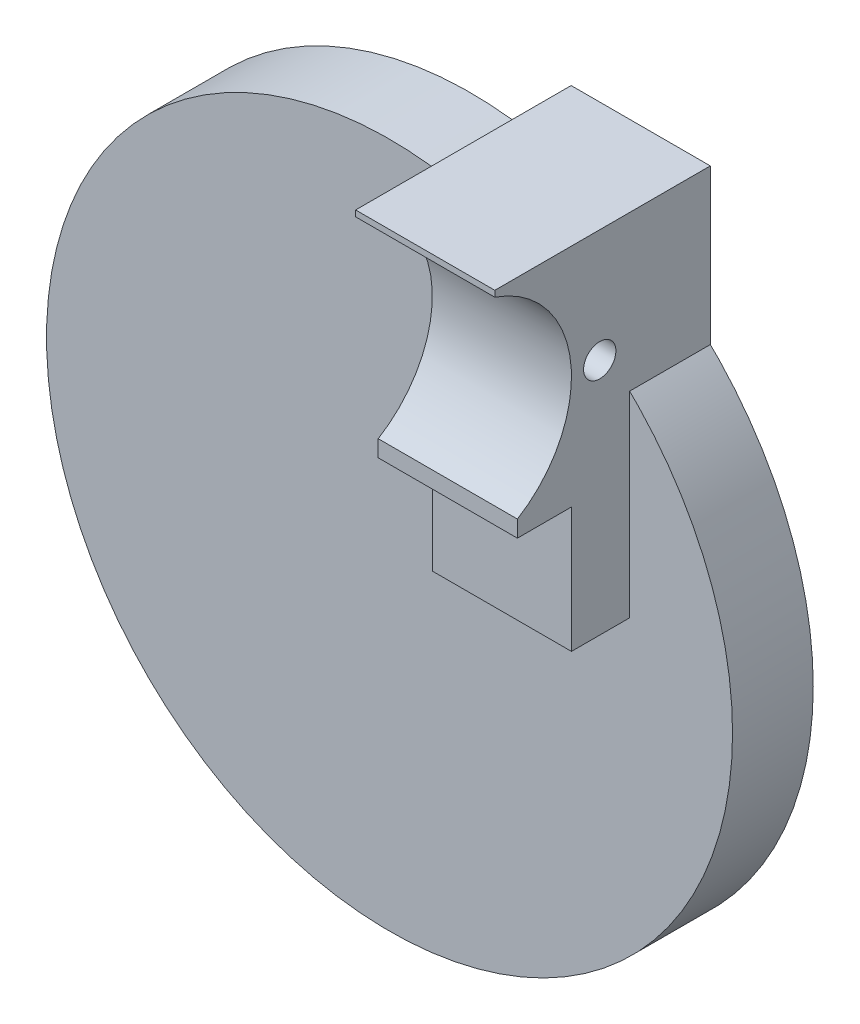
ISO-10303-21;
HEADER;
FILE_DESCRIPTION(('STEP AP214'),'2;1');
FILE_NAME('part.step','',(''),(''),'','','');
FILE_SCHEMA(('AUTOMOTIVE_DESIGN { 1 0 10303 214 1 1 1 1 }'));
ENDSEC;
DATA;
#1=APPLICATION_CONTEXT('core data for automotive mechanical design processes');
#2=APPLICATION_PROTOCOL_DEFINITION('international standard','automotive_design',2000,#1);
#3=PRODUCT_CONTEXT('',#1,'mechanical');
#4=PRODUCT('Part','Part','',(#3));
#5=PRODUCT_RELATED_PRODUCT_CATEGORY('part','',(#4));
#6=PRODUCT_DEFINITION_FORMATION('','',#4);
#7=PRODUCT_DEFINITION_CONTEXT('part definition',#1,'design');
#8=PRODUCT_DEFINITION('design','',#6,#7);
#9=PRODUCT_DEFINITION_SHAPE('','',#8);
#10=(LENGTH_UNIT() NAMED_UNIT(*) SI_UNIT(.MILLI.,.METRE.));
#11=(NAMED_UNIT(*) PLANE_ANGLE_UNIT() SI_UNIT($,.RADIAN.));
#12=(NAMED_UNIT(*) SI_UNIT($,.STERADIAN.) SOLID_ANGLE_UNIT());
#13=UNCERTAINTY_MEASURE_WITH_UNIT(LENGTH_MEASURE(1.E-05),#10,'distance_accuracy_value','');
#14=(GEOMETRIC_REPRESENTATION_CONTEXT(3) GLOBAL_UNCERTAINTY_ASSIGNED_CONTEXT((#13)) GLOBAL_UNIT_ASSIGNED_CONTEXT((#10,
#11,#12)) REPRESENTATION_CONTEXT('',''));
#15=CARTESIAN_POINT('',(0.,0.,0.));
#16=DIRECTION('',(0.,0.,1.));
#17=DIRECTION('',(1.,0.,0.));
#18=AXIS2_PLACEMENT_3D('',#15,#16,#17);
#19=CARTESIAN_POINT('',(12.5,49.5,17.2));
#20=DIRECTION('',(1.,0.,0.));
#21=DIRECTION('',(0.,1.,0.));
#22=AXIS2_PLACEMENT_3D('',#19,#20,#21);
#23=PLANE('',#22);
#24=CARTESIAN_POINT('',(12.5,35.5,13.7));
#25=DIRECTION('',(1.,0.,0.));
#26=DIRECTION('',(0.,1.,0.));
#27=AXIS2_PLACEMENT_3D('',#24,#25,#26);
#28=CIRCLE('',#27,2.);
#29=CARTESIAN_POINT('',(12.5,37.5,13.7));
#30=VERTEX_POINT('',#29);
#31=EDGE_CURVE('E242',#30,#30,#28,.F.);
#32=ORIENTED_EDGE('',*,*,#31,.F.);
#33=EDGE_LOOP('',(#32));
#34=FACE_BOUND('',#33,.T.);
#35=CARTESIAN_POINT('',(12.5,18.7225374558526,7.5));
#36=DIRECTION('',(1.,0.,0.));
#37=DIRECTION('',(0.,1.,0.));
#38=AXIS2_PLACEMENT_3D('',#35,#36,#37);
#39=CIRCLE('',#38,1.5);
#40=CARTESIAN_POINT('',(12.5,20.2225374558526,7.5));
#41=VERTEX_POINT('',#40);
#42=EDGE_CURVE('E261',#41,#41,#39,.T.);
#43=ORIENTED_EDGE('',*,*,#42,.T.);
#44=EDGE_LOOP('',(#43));
#45=FACE_BOUND('',#44,.T.);
#46=DIRECTION('',(0.,0.,1.));
#47=VECTOR('',#46,1.);
#48=CARTESIAN_POINT('',(12.5,21.5,17.2));
#49=LINE('',#48,#47);
#50=CARTESIAN_POINT('',(12.5,21.5,17.2));
#51=VERTEX_POINT('',#50);
#52=CARTESIAN_POINT('',(12.5,21.5,23.9));
#53=VERTEX_POINT('',#52);
#54=EDGE_CURVE('E250',#51,#53,#49,.T.);
#55=ORIENTED_EDGE('',*,*,#54,.T.);
#56=DIRECTION('',(0.,-1.,0.));
#57=VECTOR('',#56,1.);
#58=CARTESIAN_POINT('',(12.5,49.501,23.9));
#59=LINE('',#58,#57);
#60=CARTESIAN_POINT('',(12.5,23.5538709198335,23.9));
#61=VERTEX_POINT('',#60);
#62=EDGE_CURVE('E237',#61,#53,#59,.T.);
#63=ORIENTED_EDGE('',*,*,#62,.F.);
#64=CARTESIAN_POINT('',(12.5,35.5,31.2));
#65=DIRECTION('',(1.,0.,0.));
#66=DIRECTION('',(0.,1.,0.));
#67=AXIS2_PLACEMENT_3D('',#64,#65,#66);
#68=CIRCLE('',#67,14.);
#69=CARTESIAN_POINT('',(12.5,48.7570735835628,26.7));
#70=VERTEX_POINT('',#69);
#71=EDGE_CURVE('E247',#70,#61,#68,.F.);
#72=ORIENTED_EDGE('',*,*,#71,.F.);
#73=DIRECTION('',(0.,1.,0.));
#74=VECTOR('',#73,1.);
#75=CARTESIAN_POINT('',(12.5,3.67961088834941,26.7));
#76=LINE('',#75,#74);
#77=CARTESIAN_POINT('',(12.5,49.5,26.7));
#78=VERTEX_POINT('',#77);
#79=EDGE_CURVE('E171',#70,#78,#76,.T.);
#80=ORIENTED_EDGE('',*,*,#79,.T.);
#81=DIRECTION('',(0.,0.,-1.));
#82=VECTOR('',#81,1.);
#83=CARTESIAN_POINT('',(12.5,49.5,17.2));
#84=LINE('',#83,#82);
#85=CARTESIAN_POINT('',(12.5,49.5,0.));
#86=VERTEX_POINT('',#85);
#87=EDGE_CURVE('E335',#78,#86,#84,.T.);
#88=ORIENTED_EDGE('',*,*,#87,.T.);
#89=DIRECTION('',(0.,-1.,0.));
#90=VECTOR('',#89,1.);
#91=CARTESIAN_POINT('',(12.5,49.5,0.));
#92=LINE('',#91,#90);
#93=CARTESIAN_POINT('',(12.5,6.,0.));
#94=VERTEX_POINT('',#93);
#95=EDGE_CURVE('E312',#86,#94,#92,.T.);
#96=ORIENTED_EDGE('',*,*,#95,.T.);
#97=DIRECTION('',(0.,0.,-1.));
#98=VECTOR('',#97,1.);
#99=CARTESIAN_POINT('',(12.5,6.,17.2));
#100=LINE('',#99,#98);
#101=CARTESIAN_POINT('',(12.5,6.,17.2));
#102=VERTEX_POINT('',#101);
#103=EDGE_CURVE('E327',#102,#94,#100,.T.);
#104=ORIENTED_EDGE('',*,*,#103,.F.);
#105=DIRECTION('',(0.,-1.,0.));
#106=VECTOR('',#105,1.);
#107=CARTESIAN_POINT('',(12.5,49.5,17.2));
#108=LINE('',#107,#106);
#109=EDGE_CURVE('E322',#51,#102,#108,.T.);
#110=ORIENTED_EDGE('',*,*,#109,.F.);
#111=EDGE_LOOP('',(#55,#63,#72,#80,#88,#96,#104,#110));
#112=FACE_BOUND('',#111,.T.);
#113=ADVANCED_FACE('F147',(#34,#45,#112),#23,.F.);
#114=CARTESIAN_POINT('',(12.5,6.,17.2));
#115=DIRECTION('',(0.,1.,0.));
#116=DIRECTION('',(0.,0.,1.));
#117=AXIS2_PLACEMENT_3D('',#114,#115,#116);
#118=PLANE('',#117);
#119=DIRECTION('',(-1.,0.,0.));
#120=VECTOR('',#119,1.);
#121=CARTESIAN_POINT('',(14.5,6.,15.2));
#122=LINE('',#121,#120);
#123=CARTESIAN_POINT('',(27.7428613661026,6.,15.2));
#124=VERTEX_POINT('',#123);
#125=CARTESIAN_POINT('',(14.5,6.,15.2));
#126=VERTEX_POINT('',#125);
#127=EDGE_CURVE('E302',#124,#126,#122,.T.);
#128=ORIENTED_EDGE('',*,*,#127,.F.);
#129=DIRECTION('',(0.,0.,1.));
#130=VECTOR('',#129,1.);
#131=CARTESIAN_POINT('',(27.7428613661026,6.,15.2));
#132=LINE('',#131,#130);
#133=CARTESIAN_POINT('',(27.7428613661026,6.,2.));
#134=VERTEX_POINT('',#133);
#135=EDGE_CURVE('E286',#134,#124,#132,.T.);
#136=ORIENTED_EDGE('',*,*,#135,.F.);
#137=DIRECTION('',(1.,0.,0.));
#138=VECTOR('',#137,1.);
#139=CARTESIAN_POINT('',(14.5,6.,2.));
#140=LINE('',#139,#138);
#141=CARTESIAN_POINT('',(14.5,6.,2.));
#142=VERTEX_POINT('',#141);
#143=EDGE_CURVE('E291',#142,#134,#140,.T.);
#144=ORIENTED_EDGE('',*,*,#143,.F.);
#145=DIRECTION('',(0.,0.,-1.));
#146=VECTOR('',#145,1.);
#147=CARTESIAN_POINT('',(14.5,6.,15.2));
#148=LINE('',#147,#146);
#149=EDGE_CURVE('E305',#126,#142,#148,.T.);
#150=ORIENTED_EDGE('',*,*,#149,.F.);
#151=EDGE_LOOP('',(#128,#136,#144,#150));
#152=FACE_BOUND('',#151,.T.);
#153=DIRECTION('',(1.,0.,0.));
#154=VECTOR('',#153,1.);
#155=CARTESIAN_POINT('',(12.5,6.,0.));
#156=LINE('',#155,#154);
#157=CARTESIAN_POINT('',(29.7428613661026,6.,0.));
#158=VERTEX_POINT('',#157);
#159=EDGE_CURVE('E342',#94,#158,#156,.T.);
#160=ORIENTED_EDGE('',*,*,#159,.T.);
#161=DIRECTION('',(0.,0.,-1.));
#162=VECTOR('',#161,1.);
#163=CARTESIAN_POINT('',(29.7428613661026,6.,17.2));
#164=LINE('',#163,#162);
#165=CARTESIAN_POINT('',(29.7428613661026,6.,17.2));
#166=VERTEX_POINT('',#165);
#167=EDGE_CURVE('E330',#166,#158,#164,.T.);
#168=ORIENTED_EDGE('',*,*,#167,.F.);
#169=DIRECTION('',(1.,0.,0.));
#170=VECTOR('',#169,1.);
#171=CARTESIAN_POINT('',(12.5,6.,17.2));
#172=LINE('',#171,#170);
#173=EDGE_CURVE('E321',#102,#166,#172,.T.);
#174=ORIENTED_EDGE('',*,*,#173,.F.);
#175=ORIENTED_EDGE('',*,*,#103,.T.);
#176=EDGE_LOOP('',(#160,#168,#174,#175));
#177=FACE_BOUND('',#176,.T.);
#178=ADVANCED_FACE('F356',(#152,#177),#118,.F.);
#179=CARTESIAN_POINT('',(29.7428613661026,49.5,17.2));
#180=DIRECTION('',(-1.,0.,0.));
#181=DIRECTION('',(0.,0.,1.));
#182=AXIS2_PLACEMENT_3D('',#179,#180,#181);
#183=PLANE('',#182);
#184=CARTESIAN_POINT('',(29.7428613661026,35.5,13.7));
#185=DIRECTION('',(1.,0.,0.));
#186=DIRECTION('',(0.,0.,-1.));
#187=AXIS2_PLACEMENT_3D('',#184,#185,#186);
#188=CIRCLE('',#187,2.);
#189=CARTESIAN_POINT('',(29.7428613661026,35.5,11.7));
#190=VERTEX_POINT('',#189);
#191=EDGE_CURVE('E552',#190,#190,#188,.T.);
#192=ORIENTED_EDGE('',*,*,#191,.F.);
#193=EDGE_LOOP('',(#192));
#194=FACE_BOUND('',#193,.T.);
#195=CARTESIAN_POINT('',(29.7428613661026,18.7225374558526,7.5));
#196=DIRECTION('',(-1.,0.,0.));
#197=DIRECTION('',(0.,0.,1.));
#198=AXIS2_PLACEMENT_3D('',#195,#196,#197);
#199=CIRCLE('',#198,1.5);
#200=CARTESIAN_POINT('',(29.7428613661026,18.7225374558526,9.));
#201=VERTEX_POINT('',#200);
#202=EDGE_CURVE('E156',#201,#201,#199,.F.);
#203=ORIENTED_EDGE('',*,*,#202,.F.);
#204=EDGE_LOOP('',(#203));
#205=FACE_BOUND('',#204,.T.);
#206=CARTESIAN_POINT('',(29.7428613661026,35.5,31.2));
#207=DIRECTION('',(1.,0.,0.));
#208=DIRECTION('',(0.,0.,-1.));
#209=AXIS2_PLACEMENT_3D('',#206,#207,#208);
#210=CIRCLE('',#209,14.);
#211=CARTESIAN_POINT('',(29.7428613661026,23.5538709198335,23.9));
#212=VERTEX_POINT('',#211);
#213=CARTESIAN_POINT('',(29.7428613661026,48.7570735835628,26.7));
#214=VERTEX_POINT('',#213);
#215=EDGE_CURVE('E253',#212,#214,#210,.T.);
#216=ORIENTED_EDGE('',*,*,#215,.F.);
#217=DIRECTION('',(0.,-1.,0.));
#218=VECTOR('',#217,1.);
#219=CARTESIAN_POINT('',(29.7428613661026,49.501,23.9));
#220=LINE('',#219,#218);
#221=CARTESIAN_POINT('',(29.7428613661026,21.5,23.9));
#222=VERTEX_POINT('',#221);
#223=EDGE_CURVE('E163',#212,#222,#220,.T.);
#224=ORIENTED_EDGE('',*,*,#223,.T.);
#225=DIRECTION('',(0.,0.,-1.));
#226=VECTOR('',#225,1.);
#227=CARTESIAN_POINT('',(29.7428613661026,21.5,17.2));
#228=LINE('',#227,#226);
#229=CARTESIAN_POINT('',(29.7428613661026,21.5,17.2));
#230=VERTEX_POINT('',#229);
#231=EDGE_CURVE('E150',#222,#230,#228,.T.);
#232=ORIENTED_EDGE('',*,*,#231,.T.);
#233=DIRECTION('',(0.,1.,0.));
#234=VECTOR('',#233,1.);
#235=CARTESIAN_POINT('',(29.7428613661026,49.5,17.2));
#236=LINE('',#235,#234);
#237=EDGE_CURVE('E266',#166,#230,#236,.T.);
#238=ORIENTED_EDGE('',*,*,#237,.F.);
#239=ORIENTED_EDGE('',*,*,#167,.T.);
#240=DIRECTION('',(0.,1.,0.));
#241=VECTOR('',#240,1.);
#242=CARTESIAN_POINT('',(29.7428613661026,49.5,0.));
#243=LINE('',#242,#241);
#244=CARTESIAN_POINT('',(29.7428613661026,49.5,0.));
#245=VERTEX_POINT('',#244);
#246=EDGE_CURVE('E339',#158,#245,#243,.T.);
#247=ORIENTED_EDGE('',*,*,#246,.T.);
#248=DIRECTION('',(0.,0.,-1.));
#249=VECTOR('',#248,1.);
#250=CARTESIAN_POINT('',(29.7428613661026,49.5,17.2));
#251=LINE('',#250,#249);
#252=CARTESIAN_POINT('',(29.7428613661026,49.5,26.7));
#253=VERTEX_POINT('',#252);
#254=EDGE_CURVE('E333',#253,#245,#251,.T.);
#255=ORIENTED_EDGE('',*,*,#254,.F.);
#256=DIRECTION('',(0.,1.,0.));
#257=VECTOR('',#256,1.);
#258=CARTESIAN_POINT('',(29.7428613661026,3.67961088834941,26.7));
#259=LINE('',#258,#257);
#260=EDGE_CURVE('E368',#214,#253,#259,.T.);
#261=ORIENTED_EDGE('',*,*,#260,.F.);
#262=EDGE_LOOP('',(#216,#224,#232,#238,#239,#247,#255,#261));
#263=FACE_BOUND('',#262,.T.);
#264=ADVANCED_FACE('F378',(#194,#205,#263),#183,.F.);
#265=CARTESIAN_POINT('',(12.5,49.5,17.2));
#266=DIRECTION('',(0.,-1.,0.));
#267=DIRECTION('',(0.,0.,-1.));
#268=AXIS2_PLACEMENT_3D('',#265,#266,#267);
#269=PLANE('',#268);
#270=ORIENTED_EDGE('',*,*,#87,.F.);
#271=DIRECTION('',(-1.,0.,0.));
#272=VECTOR('',#271,1.);
#273=CARTESIAN_POINT('',(12.5,49.5,26.7));
#274=LINE('',#273,#272);
#275=EDGE_CURVE('E366',#253,#78,#274,.T.);
#276=ORIENTED_EDGE('',*,*,#275,.F.);
#277=ORIENTED_EDGE('',*,*,#254,.T.);
#278=DIRECTION('',(-1.,0.,0.));
#279=VECTOR('',#278,1.);
#280=CARTESIAN_POINT('',(12.5,49.5,0.));
#281=LINE('',#280,#279);
#282=EDGE_CURVE('E324',#245,#86,#281,.T.);
#283=ORIENTED_EDGE('',*,*,#282,.T.);
#284=EDGE_LOOP('',(#270,#276,#277,#283));
#285=FACE_BOUND('',#284,.T.);
#286=ADVANCED_FACE('F377',(#285),#269,.F.);
#287=CARTESIAN_POINT('',(0.,0.,17.2));
#288=DIRECTION('',(0.,0.,1.));
#289=DIRECTION('',(1.,0.,0.));
#290=AXIS2_PLACEMENT_3D('',#287,#288,#289);
#291=PLANE('',#290);
#292=DIRECTION('',(1.,0.,0.));
#293=VECTOR('',#292,1.);
#294=CARTESIAN_POINT('',(-18.804951684997,21.5,17.2));
#295=LINE('',#294,#293);
#296=EDGE_CURVE('E255',#51,#230,#295,.T.);
#297=ORIENTED_EDGE('',*,*,#296,.F.);
#298=ORIENTED_EDGE('',*,*,#109,.T.);
#299=ORIENTED_EDGE('',*,*,#173,.T.);
#300=ORIENTED_EDGE('',*,*,#237,.T.);
#301=EDGE_LOOP('',(#297,#298,#299,#300));
#302=FACE_BOUND('',#301,.T.);
#303=ADVANCED_FACE('F360',(#302),#291,.T.);
#304=CARTESIAN_POINT('',(0.,0.,0.));
#305=DIRECTION('',(0.,0.,1.));
#306=DIRECTION('',(1.,0.,0.));
#307=AXIS2_PLACEMENT_3D('',#304,#305,#306);
#308=PLANE('',#307);
#309=ORIENTED_EDGE('',*,*,#95,.F.);
#310=ORIENTED_EDGE('',*,*,#282,.F.);
#311=ORIENTED_EDGE('',*,*,#246,.F.);
#312=ORIENTED_EDGE('',*,*,#159,.F.);
#313=EDGE_LOOP('',(#309,#310,#311,#312));
#314=FACE_BOUND('',#313,.T.);
#315=ADVANCED_FACE('F351',(#314),#308,.F.);
#316=CARTESIAN_POINT('',(27.7428613661026,30.,15.2));
#317=DIRECTION('',(1.,0.,0.));
#318=DIRECTION('',(0.,0.,-1.));
#319=AXIS2_PLACEMENT_3D('',#316,#317,#318);
#320=PLANE('',#319);
#321=ORIENTED_EDGE('',*,*,#135,.T.);
#322=DIRECTION('',(0.,-1.,0.));
#323=VECTOR('',#322,1.);
#324=CARTESIAN_POINT('',(27.7428613661026,30.,15.2));
#325=LINE('',#324,#323);
#326=CARTESIAN_POINT('',(27.7428613661026,30.,15.2));
#327=VERTEX_POINT('',#326);
#328=EDGE_CURVE('E300',#327,#124,#325,.T.);
#329=ORIENTED_EDGE('',*,*,#328,.F.);
#330=DIRECTION('',(0.,0.,1.));
#331=VECTOR('',#330,1.);
#332=CARTESIAN_POINT('',(27.7428613661026,30.,15.2));
#333=LINE('',#332,#331);
#334=CARTESIAN_POINT('',(27.7428613661026,30.,2.));
#335=VERTEX_POINT('',#334);
#336=EDGE_CURVE('E287',#335,#327,#333,.T.);
#337=ORIENTED_EDGE('',*,*,#336,.F.);
#338=DIRECTION('',(0.,-1.,0.));
#339=VECTOR('',#338,1.);
#340=CARTESIAN_POINT('',(27.7428613661026,30.,2.));
#341=LINE('',#340,#339);
#342=EDGE_CURVE('E310',#335,#134,#341,.T.);
#343=ORIENTED_EDGE('',*,*,#342,.T.);
#344=EDGE_LOOP('',(#321,#329,#337,#343));
#345=FACE_BOUND('',#344,.T.);
#346=ADVANCED_FACE('F427',(#345),#320,.F.);
#347=CARTESIAN_POINT('',(14.5,30.,2.));
#348=DIRECTION('',(0.,0.,-1.));
#349=DIRECTION('',(-1.,0.,0.));
#350=AXIS2_PLACEMENT_3D('',#347,#348,#349);
#351=PLANE('',#350);
#352=ORIENTED_EDGE('',*,*,#143,.T.);
#353=ORIENTED_EDGE('',*,*,#342,.F.);
#354=DIRECTION('',(1.,0.,0.));
#355=VECTOR('',#354,1.);
#356=CARTESIAN_POINT('',(14.5,30.,2.));
#357=LINE('',#356,#355);
#358=CARTESIAN_POINT('',(14.5,30.,2.));
#359=VERTEX_POINT('',#358);
#360=EDGE_CURVE('E297',#359,#335,#357,.T.);
#361=ORIENTED_EDGE('',*,*,#360,.F.);
#362=DIRECTION('',(0.,-1.,0.));
#363=VECTOR('',#362,1.);
#364=CARTESIAN_POINT('',(14.5,30.,2.));
#365=LINE('',#364,#363);
#366=EDGE_CURVE('E313',#359,#142,#365,.T.);
#367=ORIENTED_EDGE('',*,*,#366,.T.);
#368=EDGE_LOOP('',(#352,#353,#361,#367));
#369=FACE_BOUND('',#368,.T.);
#370=ADVANCED_FACE('F423',(#369),#351,.F.);
#371=CARTESIAN_POINT('',(14.5,30.,15.2));
#372=DIRECTION('',(-1.,0.,0.));
#373=DIRECTION('',(0.,0.,1.));
#374=AXIS2_PLACEMENT_3D('',#371,#372,#373);
#375=PLANE('',#374);
#376=ORIENTED_EDGE('',*,*,#149,.T.);
#377=ORIENTED_EDGE('',*,*,#366,.F.);
#378=DIRECTION('',(0.,0.,-1.));
#379=VECTOR('',#378,1.);
#380=CARTESIAN_POINT('',(14.5,30.,15.2));
#381=LINE('',#380,#379);
#382=CARTESIAN_POINT('',(14.5,30.,15.2));
#383=VERTEX_POINT('',#382);
#384=EDGE_CURVE('E294',#383,#359,#381,.T.);
#385=ORIENTED_EDGE('',*,*,#384,.F.);
#386=DIRECTION('',(0.,-1.,0.));
#387=VECTOR('',#386,1.);
#388=CARTESIAN_POINT('',(14.5,30.,15.2));
#389=LINE('',#388,#387);
#390=EDGE_CURVE('E315',#383,#126,#389,.T.);
#391=ORIENTED_EDGE('',*,*,#390,.T.);
#392=EDGE_LOOP('',(#376,#377,#385,#391));
#393=FACE_BOUND('',#392,.T.);
#394=ADVANCED_FACE('F426',(#393),#375,.F.);
#395=CARTESIAN_POINT('',(14.5,30.,15.2));
#396=DIRECTION('',(0.,0.,1.));
#397=DIRECTION('',(1.,0.,0.));
#398=AXIS2_PLACEMENT_3D('',#395,#396,#397);
#399=PLANE('',#398);
#400=ORIENTED_EDGE('',*,*,#127,.T.);
#401=ORIENTED_EDGE('',*,*,#390,.F.);
#402=DIRECTION('',(-1.,0.,0.));
#403=VECTOR('',#402,1.);
#404=CARTESIAN_POINT('',(14.5,30.,15.2));
#405=LINE('',#404,#403);
#406=EDGE_CURVE('E290',#327,#383,#405,.T.);
#407=ORIENTED_EDGE('',*,*,#406,.F.);
#408=ORIENTED_EDGE('',*,*,#328,.T.);
#409=EDGE_LOOP('',(#400,#401,#407,#408));
#410=FACE_BOUND('',#409,.T.);
#411=ADVANCED_FACE('F421',(#410),#399,.F.);
#412=CARTESIAN_POINT('',(0.,30.,0.));
#413=DIRECTION('',(0.,-1.,0.));
#414=DIRECTION('',(0.,0.,-1.));
#415=AXIS2_PLACEMENT_3D('',#412,#413,#414);
#416=PLANE('',#415);
#417=ORIENTED_EDGE('',*,*,#336,.T.);
#418=ORIENTED_EDGE('',*,*,#406,.T.);
#419=ORIENTED_EDGE('',*,*,#384,.T.);
#420=ORIENTED_EDGE('',*,*,#360,.T.);
#421=EDGE_LOOP('',(#417,#418,#419,#420));
#422=FACE_BOUND('',#421,.T.);
#423=ADVANCED_FACE('F417',(#422),#416,.T.);
#424=CARTESIAN_POINT('',(34.7428613661026,18.7225374558526,7.5));
#425=DIRECTION('',(-1.,0.,0.));
#426=DIRECTION('',(0.,0.,1.));
#427=AXIS2_PLACEMENT_3D('',#424,#425,#426);
#428=CYLINDRICAL_SURFACE('',#427,1.5);
#429=CARTESIAN_POINT('',(34.7428613661026,18.7225374558526,7.5));
#430=DIRECTION('',(1.,0.,0.));
#431=DIRECTION('',(0.,0.,-1.));
#432=AXIS2_PLACEMENT_3D('',#429,#430,#431);
#433=CIRCLE('',#432,1.5);
#434=CARTESIAN_POINT('',(34.7428613661026,18.7225374558526,6.));
#435=VERTEX_POINT('',#434);
#436=EDGE_CURVE('E282',#435,#435,#433,.T.);
#437=ORIENTED_EDGE('',*,*,#436,.F.);
#438=EDGE_LOOP('',(#437));
#439=FACE_BOUND('',#438,.T.);
#440=ORIENTED_EDGE('',*,*,#202,.T.);
#441=EDGE_LOOP('',(#440));
#442=FACE_BOUND('',#441,.T.);
#443=ADVANCED_FACE('F410',(#439,#442),#428,.T.);
#444=CARTESIAN_POINT('',(34.7428613661026,18.7225374558526,7.5));
#445=DIRECTION('',(1.,0.,0.));
#446=DIRECTION('',(0.,0.,-1.));
#447=AXIS2_PLACEMENT_3D('',#444,#445,#446);
#448=PLANE('',#447);
#449=ORIENTED_EDGE('',*,*,#436,.T.);
#450=EDGE_LOOP('',(#449));
#451=FACE_BOUND('',#450,.T.);
#452=ADVANCED_FACE('F402',(#451),#448,.T.);
#453=CARTESIAN_POINT('',(12.5,18.7225374558526,7.5));
#454=DIRECTION('',(1.,0.,0.));
#455=DIRECTION('',(0.,1.,0.));
#456=AXIS2_PLACEMENT_3D('',#453,#454,#455);
#457=CYLINDRICAL_SURFACE('',#456,1.5);
#458=CARTESIAN_POINT('',(7.50000000000001,18.7225374558526,7.5));
#459=DIRECTION('',(1.,0.,0.));
#460=DIRECTION('',(0.,1.,0.));
#461=AXIS2_PLACEMENT_3D('',#458,#459,#460);
#462=CIRCLE('',#461,1.5);
#463=CARTESIAN_POINT('',(7.50000000000001,20.2225374558526,7.5));
#464=VERTEX_POINT('',#463);
#465=EDGE_CURVE('E272',#464,#464,#462,.T.);
#466=CARTESIAN_POINT('',(12.5,20.2225374558526,7.5));
#467=CARTESIAN_POINT('',(12.4479166666667,20.2225374558526,7.5));
#468=CARTESIAN_POINT('',(12.3958333333333,20.2225374558526,7.5));
#469=CARTESIAN_POINT('',(12.2916666666667,20.2225374558526,7.5));
#470=CARTESIAN_POINT('',(12.2395833333333,20.2225374558526,7.5));
#471=CARTESIAN_POINT('',(12.1354166666667,20.2225374558526,7.5));
#472=CARTESIAN_POINT('',(12.0833333333333,20.2225374558526,7.5));
#473=CARTESIAN_POINT('',(11.9791666666667,20.2225374558526,7.5));
#474=CARTESIAN_POINT('',(11.9270833333333,20.2225374558526,7.5));
#475=CARTESIAN_POINT('',(11.8229166666667,20.2225374558526,7.5));
#476=CARTESIAN_POINT('',(11.7708333333333,20.2225374558526,7.5));
#477=CARTESIAN_POINT('',(11.6666666666667,20.2225374558526,7.5));
#478=CARTESIAN_POINT('',(11.6145833333333,20.2225374558526,7.5));
#479=CARTESIAN_POINT('',(11.5104166666667,20.2225374558526,7.5));
#480=CARTESIAN_POINT('',(11.4583333333333,20.2225374558526,7.5));
#481=CARTESIAN_POINT('',(11.3541666666667,20.2225374558526,7.5));
#482=CARTESIAN_POINT('',(11.3020833333333,20.2225374558526,7.5));
#483=CARTESIAN_POINT('',(11.1979166666667,20.2225374558526,7.5));
#484=CARTESIAN_POINT('',(11.1458333333333,20.2225374558526,7.5));
#485=CARTESIAN_POINT('',(11.0416666666667,20.2225374558526,7.5));
#486=CARTESIAN_POINT('',(10.9895833333333,20.2225374558526,7.5));
#487=CARTESIAN_POINT('',(10.8854166666667,20.2225374558526,7.5));
#488=CARTESIAN_POINT('',(10.8333333333333,20.2225374558526,7.5));
#489=CARTESIAN_POINT('',(10.7291666666667,20.2225374558526,7.5));
#490=CARTESIAN_POINT('',(10.6770833333333,20.2225374558526,7.5));
#491=CARTESIAN_POINT('',(10.5729166666667,20.2225374558526,7.5));
#492=CARTESIAN_POINT('',(10.5208333333333,20.2225374558526,7.5));
#493=CARTESIAN_POINT('',(10.4166666666667,20.2225374558526,7.5));
#494=CARTESIAN_POINT('',(10.3645833333333,20.2225374558526,7.5));
#495=CARTESIAN_POINT('',(10.2604166666667,20.2225374558526,7.5));
#496=CARTESIAN_POINT('',(10.2083333333333,20.2225374558526,7.5));
#497=CARTESIAN_POINT('',(10.1041666666667,20.2225374558526,7.5));
#498=CARTESIAN_POINT('',(10.0520833333333,20.2225374558526,7.5));
#499=CARTESIAN_POINT('',(9.94791666666667,20.2225374558526,7.5));
#500=CARTESIAN_POINT('',(9.89583333333334,20.2225374558526,7.5));
#501=CARTESIAN_POINT('',(9.79166666666667,20.2225374558526,7.5));
#502=CARTESIAN_POINT('',(9.73958333333334,20.2225374558526,7.5));
#503=CARTESIAN_POINT('',(9.63541666666667,20.2225374558526,7.5));
#504=CARTESIAN_POINT('',(9.58333333333334,20.2225374558526,7.5));
#505=CARTESIAN_POINT('',(9.47916666666667,20.2225374558526,7.5));
#506=CARTESIAN_POINT('',(9.42708333333334,20.2225374558526,7.5));
#507=CARTESIAN_POINT('',(9.32291666666667,20.2225374558526,7.5));
#508=CARTESIAN_POINT('',(9.27083333333334,20.2225374558526,7.5));
#509=CARTESIAN_POINT('',(9.16666666666667,20.2225374558526,7.5));
#510=CARTESIAN_POINT('',(9.11458333333334,20.2225374558526,7.5));
#511=CARTESIAN_POINT('',(9.01041666666667,20.2225374558526,7.5));
#512=CARTESIAN_POINT('',(8.95833333333334,20.2225374558526,7.5));
#513=CARTESIAN_POINT('',(8.85416666666667,20.2225374558526,7.5));
#514=CARTESIAN_POINT('',(8.80208333333334,20.2225374558526,7.5));
#515=CARTESIAN_POINT('',(8.69791666666667,20.2225374558526,7.5));
#516=CARTESIAN_POINT('',(8.64583333333334,20.2225374558526,7.5));
#517=CARTESIAN_POINT('',(8.54166666666667,20.2225374558526,7.5));
#518=CARTESIAN_POINT('',(8.48958333333334,20.2225374558526,7.5));
#519=CARTESIAN_POINT('',(8.38541666666667,20.2225374558526,7.5));
#520=CARTESIAN_POINT('',(8.33333333333334,20.2225374558526,7.5));
#521=CARTESIAN_POINT('',(8.22916666666667,20.2225374558526,7.5));
#522=CARTESIAN_POINT('',(8.17708333333334,20.2225374558526,7.5));
#523=CARTESIAN_POINT('',(8.07291666666667,20.2225374558526,7.5));
#524=CARTESIAN_POINT('',(8.02083333333334,20.2225374558526,7.5));
#525=CARTESIAN_POINT('',(7.91666666666667,20.2225374558526,7.5));
#526=CARTESIAN_POINT('',(7.86458333333334,20.2225374558526,7.5));
#527=CARTESIAN_POINT('',(7.76041666666667,20.2225374558526,7.5));
#528=CARTESIAN_POINT('',(7.70833333333334,20.2225374558526,7.5));
#529=CARTESIAN_POINT('',(7.60416666666667,20.2225374558526,7.5));
#530=CARTESIAN_POINT('',(7.55208333333334,20.2225374558526,7.5));
#531=CARTESIAN_POINT('',(7.50000000000001,20.2225374558526,7.5));
#532=B_SPLINE_CURVE_WITH_KNOTS('',3,(#466,#467,#468,#469,#470,#471,#472,#473,#474,#475,#476,
#477,#478,#479,#480,#481,#482,#483,#484,#485,#486,#487,#488,#489,#490,#491,#492,#493,#494,#495,
#496,#497,#498,#499,#500,#501,#502,#503,#504,#505,#506,#507,#508,#509,#510,#511,#512,#513,#514,
#515,#516,#517,#518,#519,#520,#521,#522,#523,#524,#525,#526,#527,#528,#529,#530,#531),
.UNSPECIFIED.,.F.,.F.,(4,2,2,2,2,2,2,2,2,2,2,2,2,2,2,2,2,2,2,2,2,2,2,2,2,2,2,2,2,2,2,2,4),(0.,
0.156249999999998,0.312499999999999,0.468749999999999,0.624999999999999,0.781249999999999,
0.937499999999999,1.09375,1.25,1.40625,1.5625,1.71875,1.875,2.03125,2.1875,2.34375,2.5,2.65625,
2.8125,2.96875,3.125,3.28125,3.4375,3.59375,3.75,3.90625,4.0625,4.21875,4.375,4.53125,4.6875,
4.84375,5.),.UNSPECIFIED.);
#533=EDGE_CURVE('BSEAM399',#41,#464,#532,.T.);
#534=ORIENTED_EDGE('',*,*,#42,.F.);
#535=ORIENTED_EDGE('',*,*,#465,.T.);
#536=ORIENTED_EDGE('',*,*,#533,.T.);
#537=ORIENTED_EDGE('',*,*,#533,.F.);
#538=EDGE_LOOP('',(#534,#536,#535,#537));
#539=FACE_BOUND('',#538,.T.);
#540=ADVANCED_FACE('F399',(#539),#457,.T.);
#541=CARTESIAN_POINT('',(7.5,49.5,17.2));
#542=DIRECTION('',(1.,0.,0.));
#543=DIRECTION('',(0.,1.,0.));
#544=AXIS2_PLACEMENT_3D('',#541,#542,#543);
#545=PLANE('',#544);
#546=ORIENTED_EDGE('',*,*,#465,.F.);
#547=EDGE_LOOP('',(#546));
#548=FACE_BOUND('',#547,.T.);
#549=ADVANCED_FACE('F401',(#548),#545,.F.);
#550=CARTESIAN_POINT('',(-18.804951684997,21.5,17.2));
#551=DIRECTION('',(0.,-1.,0.));
#552=DIRECTION('',(0.,0.,-1.));
#553=AXIS2_PLACEMENT_3D('',#550,#551,#552);
#554=PLANE('',#553);
#555=DIRECTION('',(1.,0.,0.));
#556=VECTOR('',#555,1.);
#557=CARTESIAN_POINT('',(-18.804951684997,21.5,23.9));
#558=LINE('',#557,#556);
#559=EDGE_CURVE('E365',#53,#222,#558,.T.);
#560=ORIENTED_EDGE('',*,*,#559,.F.);
#561=ORIENTED_EDGE('',*,*,#54,.F.);
#562=ORIENTED_EDGE('',*,*,#296,.T.);
#563=ORIENTED_EDGE('',*,*,#231,.F.);
#564=EDGE_LOOP('',(#560,#561,#562,#563));
#565=FACE_BOUND('',#564,.T.);
#566=ADVANCED_FACE('F364',(#565),#554,.T.);
#567=CARTESIAN_POINT('',(-27.0979797464466,35.5,31.2));
#568=DIRECTION('',(1.,0.,0.));
#569=DIRECTION('',(0.,0.,-1.));
#570=AXIS2_PLACEMENT_3D('',#567,#568,#569);
#571=CYLINDRICAL_SURFACE('',#570,14.);
#572=ORIENTED_EDGE('',*,*,#71,.T.);
#573=DIRECTION('',(1.,0.,0.));
#574=VECTOR('',#573,1.);
#575=CARTESIAN_POINT('',(-27.0979797464466,23.5538709198335,23.9));
#576=LINE('',#575,#574);
#577=EDGE_CURVE('E234',#212,#61,#576,.F.);
#578=ORIENTED_EDGE('',*,*,#577,.F.);
#579=ORIENTED_EDGE('',*,*,#215,.T.);
#580=DIRECTION('',(1.,0.,0.));
#581=VECTOR('',#580,1.);
#582=CARTESIAN_POINT('',(-27.0979797464466,48.7570735835628,26.7));
#583=LINE('',#582,#581);
#584=EDGE_CURVE('E14',#214,#70,#583,.F.);
#585=ORIENTED_EDGE('',*,*,#584,.T.);
#586=EDGE_LOOP('',(#572,#578,#579,#585));
#587=FACE_BOUND('',#586,.T.);
#588=ADVANCED_FACE('F252',(#587),#571,.F.);
#589=CARTESIAN_POINT('',(12.5,3.67961088834941,26.7));
#590=DIRECTION('',(0.,0.,-1.));
#591=DIRECTION('',(-1.,0.,0.));
#592=AXIS2_PLACEMENT_3D('',#589,#590,#591);
#593=PLANE('',#592);
#594=ORIENTED_EDGE('',*,*,#260,.T.);
#595=ORIENTED_EDGE('',*,*,#275,.T.);
#596=ORIENTED_EDGE('',*,*,#79,.F.);
#597=ORIENTED_EDGE('',*,*,#584,.F.);
#598=EDGE_LOOP('',(#594,#595,#596,#597));
#599=FACE_BOUND('',#598,.T.);
#600=ADVANCED_FACE('F374',(#599),#593,.F.);
#601=CARTESIAN_POINT('',(12.5,49.501,23.9));
#602=DIRECTION('',(0.,0.,-1.));
#603=DIRECTION('',(-1.,0.,0.));
#604=AXIS2_PLACEMENT_3D('',#601,#602,#603);
#605=PLANE('',#604);
#606=ORIENTED_EDGE('',*,*,#559,.T.);
#607=ORIENTED_EDGE('',*,*,#223,.F.);
#608=ORIENTED_EDGE('',*,*,#577,.T.);
#609=ORIENTED_EDGE('',*,*,#62,.T.);
#610=EDGE_LOOP('',(#606,#607,#608,#609));
#611=FACE_BOUND('',#610,.T.);
#612=ADVANCED_FACE('F236',(#611),#605,.F.);
#613=CARTESIAN_POINT('',(6.84314575050763,35.5,13.7));
#614=DIRECTION('',(1.,0.,0.));
#615=DIRECTION('',(0.,1.,0.));
#616=AXIS2_PLACEMENT_3D('',#613,#614,#615);
#617=CYLINDRICAL_SURFACE('',#616,2.);
#618=ORIENTED_EDGE('',*,*,#31,.T.);
#619=EDGE_LOOP('',(#618));
#620=FACE_BOUND('',#619,.T.);
#621=ORIENTED_EDGE('',*,*,#191,.T.);
#622=EDGE_LOOP('',(#621));
#623=FACE_BOUND('',#622,.T.);
#624=ADVANCED_FACE('F528',(#620,#623),#617,.F.);
#625=CLOSED_SHELL('',(#113,#178,#264,#286,#303,#315,#346,#370,#394,#411,#423,#443,#452,#540,
#549,#566,#588,#600,#612,#624));
#626=MANIFOLD_SOLID_BREP('B2',#625);
#627=CARTESIAN_POINT('',(0.,0.,10.));
#628=DIRECTION('',(0.,0.,-1.));
#629=DIRECTION('',(-1.,0.,0.));
#630=AXIS2_PLACEMENT_3D('',#627,#628,#629);
#631=CYLINDRICAL_SURFACE('',#630,42.5);
#632=CARTESIAN_POINT('',(0.,0.,10.));
#633=DIRECTION('',(0.,0.,1.));
#634=DIRECTION('',(1.,0.,0.));
#635=AXIS2_PLACEMENT_3D('',#632,#633,#634);
#636=CIRCLE('',#635,42.5);
#637=CARTESIAN_POINT('',(42.5,0.,10.));
#638=VERTEX_POINT('',#637);
#639=EDGE_CURVE('E146',#638,#638,#636,.T.);
#640=ORIENTED_EDGE('',*,*,#639,.F.);
#641=EDGE_LOOP('',(#640));
#642=FACE_BOUND('',#641,.T.);
#643=CARTESIAN_POINT('',(0.,0.,0.));
#644=DIRECTION('',(0.,0.,1.));
#645=DIRECTION('',(1.,0.,0.));
#646=AXIS2_PLACEMENT_3D('',#643,#644,#645);
#647=CIRCLE('',#646,42.5);
#648=CARTESIAN_POINT('',(42.5,0.,0.));
#649=VERTEX_POINT('',#648);
#650=EDGE_CURVE('E598',#649,#649,#647,.T.);
#651=ORIENTED_EDGE('',*,*,#650,.T.);
#652=EDGE_LOOP('',(#651));
#653=FACE_BOUND('',#652,.T.);
#654=ADVANCED_FACE('F595',(#642,#653),#631,.T.);
#655=CARTESIAN_POINT('',(0.,0.,10.));
#656=DIRECTION('',(0.,0.,1.));
#657=DIRECTION('',(1.,0.,0.));
#658=AXIS2_PLACEMENT_3D('',#655,#656,#657);
#659=PLANE('',#658);
#660=ORIENTED_EDGE('',*,*,#639,.T.);
#661=EDGE_LOOP('',(#660));
#662=FACE_BOUND('',#661,.T.);
#663=ADVANCED_FACE('F610',(#662),#659,.T.);
#664=CARTESIAN_POINT('',(0.,0.,0.));
#665=DIRECTION('',(0.,0.,1.));
#666=DIRECTION('',(1.,0.,0.));
#667=AXIS2_PLACEMENT_3D('',#664,#665,#666);
#668=PLANE('',#667);
#669=ORIENTED_EDGE('',*,*,#650,.F.);
#670=EDGE_LOOP('',(#669));
#671=FACE_BOUND('',#670,.T.);
#672=ADVANCED_FACE('F608',(#671),#668,.F.);
#673=CLOSED_SHELL('',(#654,#663,#672));
#674=MANIFOLD_SOLID_BREP('B8_NOT_SHOWN',#673);
#675=ADVANCED_BREP_SHAPE_REPRESENTATION('',(#18,#626,#674),#14);
#676=SHAPE_DEFINITION_REPRESENTATION(#9,#675);
ENDSEC;
END-ISO-10303-21;
